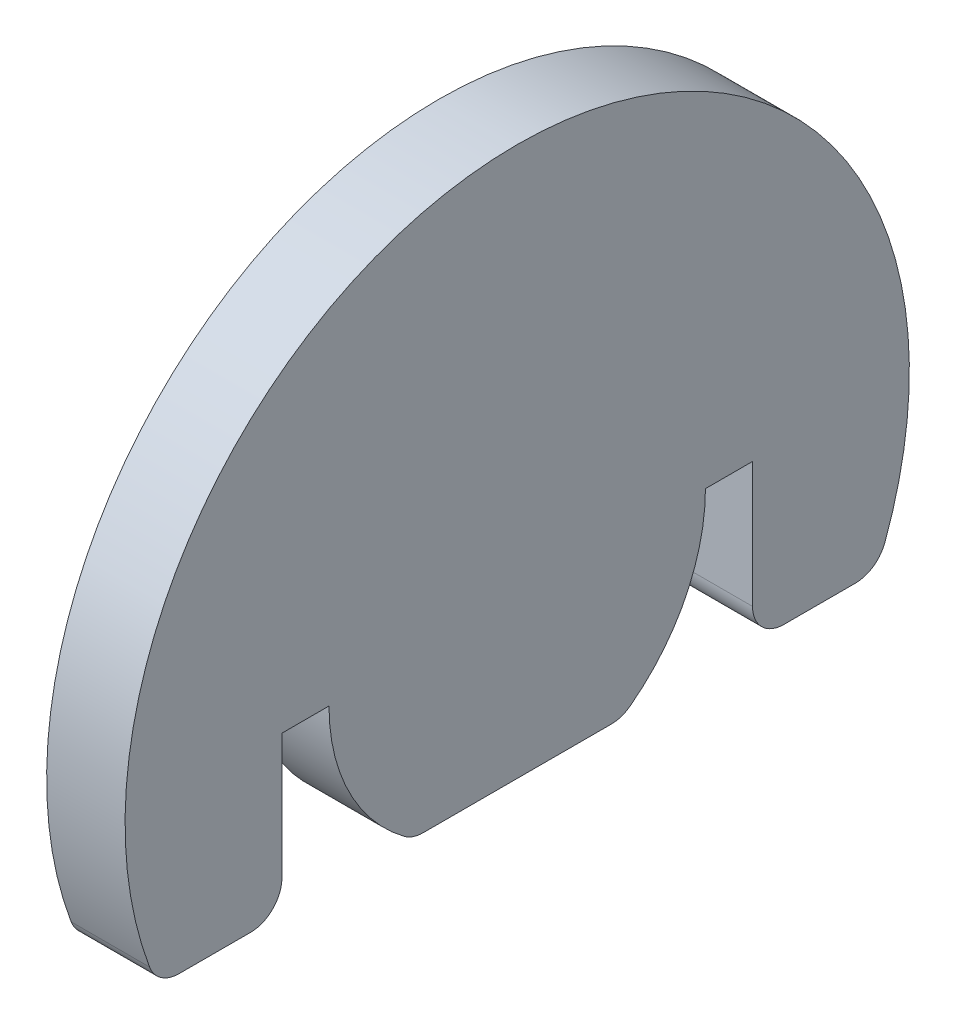
ISO-10303-21;
HEADER;
FILE_DESCRIPTION(('STEP AP214'),'2;1');
FILE_NAME('part.step','',(''),(''),'','','');
FILE_SCHEMA(('AUTOMOTIVE_DESIGN { 1 0 10303 214 1 1 1 1 }'));
ENDSEC;
DATA;
#1=APPLICATION_CONTEXT('core data for automotive mechanical design processes');
#2=APPLICATION_PROTOCOL_DEFINITION('international standard','automotive_design',2000,#1);
#3=PRODUCT_CONTEXT('',#1,'mechanical');
#4=PRODUCT('Part','Part','',(#3));
#5=PRODUCT_RELATED_PRODUCT_CATEGORY('part','',(#4));
#6=PRODUCT_DEFINITION_FORMATION('','',#4);
#7=PRODUCT_DEFINITION_CONTEXT('part definition',#1,'design');
#8=PRODUCT_DEFINITION('design','',#6,#7);
#9=PRODUCT_DEFINITION_SHAPE('','',#8);
#10=(LENGTH_UNIT() NAMED_UNIT(*) SI_UNIT(.MILLI.,.METRE.));
#11=(NAMED_UNIT(*) PLANE_ANGLE_UNIT() SI_UNIT($,.RADIAN.));
#12=(NAMED_UNIT(*) SI_UNIT($,.STERADIAN.) SOLID_ANGLE_UNIT());
#13=UNCERTAINTY_MEASURE_WITH_UNIT(LENGTH_MEASURE(1.E-05),#10,'distance_accuracy_value','');
#14=(GEOMETRIC_REPRESENTATION_CONTEXT(3) GLOBAL_UNCERTAINTY_ASSIGNED_CONTEXT((#13)) GLOBAL_UNIT_ASSIGNED_CONTEXT((#10,
#11,#12)) REPRESENTATION_CONTEXT('',''));
#15=CARTESIAN_POINT('',(0.,0.,0.));
#16=DIRECTION('',(0.,0.,1.));
#17=DIRECTION('',(1.,0.,0.));
#18=AXIS2_PLACEMENT_3D('',#15,#16,#17);
#19=CARTESIAN_POINT('',(1.25,0.,0.));
#20=DIRECTION('',(-1.,0.,0.));
#21=DIRECTION('',(0.,0.,1.));
#22=AXIS2_PLACEMENT_3D('',#19,#20,#21);
#23=CYLINDRICAL_SURFACE('',#22,6.);
#24=CARTESIAN_POINT('',(1.25,0.,0.));
#25=DIRECTION('',(1.,0.,0.));
#26=DIRECTION('',(0.,0.,-1.));
#27=AXIS2_PLACEMENT_3D('',#24,#25,#26);
#28=CIRCLE('',#27,6.);
#29=CARTESIAN_POINT('',(1.25,0.,-6.));
#30=VERTEX_POINT('',#29);
#31=CARTESIAN_POINT('',(1.25,-4.8,-3.6));
#32=VERTEX_POINT('',#31);
#33=EDGE_CURVE('E163',#30,#32,#28,.F.);
#34=ORIENTED_EDGE('',*,*,#33,.T.);
#35=DIRECTION('',(-1.,0.,0.));
#36=VECTOR('',#35,1.);
#37=CARTESIAN_POINT('',(1.25,-4.8,-3.6));
#38=LINE('',#37,#36);
#39=CARTESIAN_POINT('',(-1.25,-4.8,-3.6));
#40=VERTEX_POINT('',#39);
#41=EDGE_CURVE('E170',#32,#40,#38,.T.);
#42=ORIENTED_EDGE('',*,*,#41,.T.);
#43=CARTESIAN_POINT('',(-1.25,0.,0.));
#44=DIRECTION('',(1.,0.,0.));
#45=DIRECTION('',(0.,0.,-1.));
#46=AXIS2_PLACEMENT_3D('',#43,#44,#45);
#47=CIRCLE('',#46,6.);
#48=CARTESIAN_POINT('',(-1.25,0.,-6.));
#49=VERTEX_POINT('',#48);
#50=EDGE_CURVE('E166',#49,#40,#47,.F.);
#51=ORIENTED_EDGE('',*,*,#50,.F.);
#52=DIRECTION('',(-1.,0.,0.));
#53=VECTOR('',#52,1.);
#54=CARTESIAN_POINT('',(1.25,0.,-6.));
#55=LINE('',#54,#53);
#56=EDGE_CURVE('E159',#30,#49,#55,.T.);
#57=ORIENTED_EDGE('',*,*,#56,.F.);
#58=EDGE_LOOP('',(#34,#42,#51,#57));
#59=FACE_BOUND('',#58,.T.);
#60=ADVANCED_FACE('F43',(#59),#23,.T.);
#61=CARTESIAN_POINT('',(1.25,0.,0.));
#62=DIRECTION('',(0.,1.,0.));
#63=DIRECTION('',(0.,0.,1.));
#64=AXIS2_PLACEMENT_3D('',#61,#62,#63);
#65=PLANE('',#64);
#66=DIRECTION('',(0.,0.,-1.));
#67=VECTOR('',#66,1.);
#68=CARTESIAN_POINT('',(-1.25,0.,0.));
#69=LINE('',#68,#67);
#70=CARTESIAN_POINT('',(-1.25,0.,-7.5));
#71=VERTEX_POINT('',#70);
#72=EDGE_CURVE('E224',#49,#71,#69,.T.);
#73=ORIENTED_EDGE('',*,*,#72,.T.);
#74=DIRECTION('',(-1.,0.,0.));
#75=VECTOR('',#74,1.);
#76=CARTESIAN_POINT('',(1.25,0.,-7.5));
#77=LINE('',#76,#75);
#78=CARTESIAN_POINT('',(1.25,0.,-7.5));
#79=VERTEX_POINT('',#78);
#80=EDGE_CURVE('E171',#79,#71,#77,.T.);
#81=ORIENTED_EDGE('',*,*,#80,.F.);
#82=DIRECTION('',(0.,0.,-1.));
#83=VECTOR('',#82,1.);
#84=CARTESIAN_POINT('',(1.25,0.,0.));
#85=LINE('',#84,#83);
#86=EDGE_CURVE('E174',#30,#79,#85,.T.);
#87=ORIENTED_EDGE('',*,*,#86,.F.);
#88=ORIENTED_EDGE('',*,*,#56,.T.);
#89=EDGE_LOOP('',(#73,#81,#87,#88));
#90=FACE_BOUND('',#89,.T.);
#91=ADVANCED_FACE('F175',(#90),#65,.F.);
#92=CARTESIAN_POINT('',(1.25,0.,-7.5));
#93=DIRECTION('',(0.,0.,-1.));
#94=DIRECTION('',(0.,1.,0.));
#95=AXIS2_PLACEMENT_3D('',#92,#93,#94);
#96=PLANE('',#95);
#97=DIRECTION('',(0.,-1.,0.));
#98=VECTOR('',#97,1.);
#99=CARTESIAN_POINT('',(-1.25,0.,-7.5));
#100=LINE('',#99,#98);
#101=CARTESIAN_POINT('',(-1.25,-4.,-7.5));
#102=VERTEX_POINT('',#101);
#103=EDGE_CURVE('E227',#71,#102,#100,.T.);
#104=ORIENTED_EDGE('',*,*,#103,.T.);
#105=DIRECTION('',(-1.,0.,0.));
#106=VECTOR('',#105,1.);
#107=CARTESIAN_POINT('',(1.25,-4.,-7.5));
#108=LINE('',#107,#106);
#109=CARTESIAN_POINT('',(1.25,-4.,-7.5));
#110=VERTEX_POINT('',#109);
#111=EDGE_CURVE('E11',#102,#110,#108,.F.);
#112=ORIENTED_EDGE('',*,*,#111,.T.);
#113=DIRECTION('',(0.,-1.,0.));
#114=VECTOR('',#113,1.);
#115=CARTESIAN_POINT('',(1.25,0.,-7.5));
#116=LINE('',#115,#114);
#117=EDGE_CURVE('E180',#79,#110,#116,.T.);
#118=ORIENTED_EDGE('',*,*,#117,.F.);
#119=ORIENTED_EDGE('',*,*,#80,.T.);
#120=EDGE_LOOP('',(#104,#112,#118,#119));
#121=FACE_BOUND('',#120,.T.);
#122=ADVANCED_FACE('F388',(#121),#96,.F.);
#123=CARTESIAN_POINT('',(1.25,-5.,0.));
#124=DIRECTION('',(0.,1.,0.));
#125=DIRECTION('',(0.,0.,1.));
#126=AXIS2_PLACEMENT_3D('',#123,#124,#125);
#127=PLANE('',#126);
#128=DIRECTION('',(0.,0.,-1.));
#129=VECTOR('',#128,1.);
#130=CARTESIAN_POINT('',(-1.25,-5.,0.));
#131=LINE('',#130,#129);
#132=CARTESIAN_POINT('',(-1.25,-5.,-8.5));
#133=VERTEX_POINT('',#132);
#134=CARTESIAN_POINT('',(-1.25,-5.,-10.7819293264239));
#135=VERTEX_POINT('',#134);
#136=EDGE_CURVE('E231',#133,#135,#131,.T.);
#137=ORIENTED_EDGE('',*,*,#136,.T.);
#138=DIRECTION('',(-1.,0.,0.));
#139=VECTOR('',#138,1.);
#140=CARTESIAN_POINT('',(1.25,-5.,-10.7819293264239));
#141=LINE('',#140,#139);
#142=CARTESIAN_POINT('',(1.25,-5.,-10.7819293264239));
#143=VERTEX_POINT('',#142);
#144=EDGE_CURVE('E52',#135,#143,#141,.F.);
#145=ORIENTED_EDGE('',*,*,#144,.T.);
#146=DIRECTION('',(0.,0.,-1.));
#147=VECTOR('',#146,1.);
#148=CARTESIAN_POINT('',(1.25,-5.,0.));
#149=LINE('',#148,#147);
#150=CARTESIAN_POINT('',(1.25,-5.,-8.5));
#151=VERTEX_POINT('',#150);
#152=EDGE_CURVE('E196',#151,#143,#149,.T.);
#153=ORIENTED_EDGE('',*,*,#152,.F.);
#154=DIRECTION('',(-1.,0.,0.));
#155=VECTOR('',#154,1.);
#156=CARTESIAN_POINT('',(1.25,-5.,-8.5));
#157=LINE('',#156,#155);
#158=EDGE_CURVE('E324',#151,#133,#157,.T.);
#159=ORIENTED_EDGE('',*,*,#158,.T.);
#160=EDGE_LOOP('',(#137,#145,#153,#159));
#161=FACE_BOUND('',#160,.T.);
#162=ADVANCED_FACE('F331',(#161),#127,.F.);
#163=CARTESIAN_POINT('',(1.25,0.,0.));
#164=DIRECTION('',(-1.,0.,0.));
#165=DIRECTION('',(0.,0.,1.));
#166=AXIS2_PLACEMENT_3D('',#163,#164,#165);
#167=CYLINDRICAL_SURFACE('',#166,12.5);
#168=CARTESIAN_POINT('',(1.25,0.,0.));
#169=DIRECTION('',(1.,0.,0.));
#170=DIRECTION('',(0.,0.,-1.));
#171=AXIS2_PLACEMENT_3D('',#168,#169,#170);
#172=CIRCLE('',#171,12.5);
#173=CARTESIAN_POINT('',(1.25,-4.34782608695652,-11.7194883982869));
#174=VERTEX_POINT('',#173);
#175=CARTESIAN_POINT('',(1.25,-4.34782608695652,11.7194883982869));
#176=VERTEX_POINT('',#175);
#177=EDGE_CURVE('E200',#174,#176,#172,.T.);
#178=ORIENTED_EDGE('',*,*,#177,.F.);
#179=DIRECTION('',(-1.,0.,0.));
#180=VECTOR('',#179,1.);
#181=CARTESIAN_POINT('',(1.25,-4.34782608695652,-11.7194883982869));
#182=LINE('',#181,#180);
#183=CARTESIAN_POINT('',(-1.25,-4.34782608695652,-11.7194883982869));
#184=VERTEX_POINT('',#183);
#185=EDGE_CURVE('E320',#174,#184,#182,.T.);
#186=ORIENTED_EDGE('',*,*,#185,.T.);
#187=CARTESIAN_POINT('',(-1.25,0.,0.));
#188=DIRECTION('',(1.,0.,0.));
#189=DIRECTION('',(0.,0.,-1.));
#190=AXIS2_PLACEMENT_3D('',#187,#188,#189);
#191=CIRCLE('',#190,12.5);
#192=CARTESIAN_POINT('',(-1.25,-4.34782608695652,11.7194883982869));
#193=VERTEX_POINT('',#192);
#194=EDGE_CURVE('E235',#184,#193,#191,.T.);
#195=ORIENTED_EDGE('',*,*,#194,.T.);
#196=DIRECTION('',(-1.,0.,0.));
#197=VECTOR('',#196,1.);
#198=CARTESIAN_POINT('',(1.25,-4.34782608695652,11.7194883982869));
#199=LINE('',#198,#197);
#200=EDGE_CURVE('E317',#193,#176,#199,.F.);
#201=ORIENTED_EDGE('',*,*,#200,.T.);
#202=EDGE_LOOP('',(#178,#186,#195,#201));
#203=FACE_BOUND('',#202,.T.);
#204=ADVANCED_FACE('F342',(#203),#167,.T.);
#205=CARTESIAN_POINT('',(1.25,-5.,0.));
#206=DIRECTION('',(0.,-1.,0.));
#207=DIRECTION('',(0.,0.,-1.));
#208=AXIS2_PLACEMENT_3D('',#205,#206,#207);
#209=PLANE('',#208);
#210=DIRECTION('',(0.,0.,1.));
#211=VECTOR('',#210,1.);
#212=CARTESIAN_POINT('',(-1.25,-5.,0.));
#213=LINE('',#212,#211);
#214=CARTESIAN_POINT('',(-1.25,-5.,8.5));
#215=VERTEX_POINT('',#214);
#216=CARTESIAN_POINT('',(-1.25,-5.,10.7819293264239));
#217=VERTEX_POINT('',#216);
#218=EDGE_CURVE('E239',#215,#217,#213,.T.);
#219=ORIENTED_EDGE('',*,*,#218,.F.);
#220=DIRECTION('',(-1.,0.,0.));
#221=VECTOR('',#220,1.);
#222=CARTESIAN_POINT('',(1.25,-5.,8.5));
#223=LINE('',#222,#221);
#224=CARTESIAN_POINT('',(1.25,-5.,8.5));
#225=VERTEX_POINT('',#224);
#226=EDGE_CURVE('E314',#215,#225,#223,.F.);
#227=ORIENTED_EDGE('',*,*,#226,.T.);
#228=DIRECTION('',(0.,0.,1.));
#229=VECTOR('',#228,1.);
#230=CARTESIAN_POINT('',(1.25,-5.,0.));
#231=LINE('',#230,#229);
#232=CARTESIAN_POINT('',(1.25,-5.,10.7819293264239));
#233=VERTEX_POINT('',#232);
#234=EDGE_CURVE('E204',#225,#233,#231,.T.);
#235=ORIENTED_EDGE('',*,*,#234,.T.);
#236=DIRECTION('',(1.,0.,0.));
#237=VECTOR('',#236,1.);
#238=CARTESIAN_POINT('',(-1.25,-5.,10.7819293264239));
#239=LINE('',#238,#237);
#240=EDGE_CURVE('E310',#233,#217,#239,.F.);
#241=ORIENTED_EDGE('',*,*,#240,.T.);
#242=EDGE_LOOP('',(#219,#227,#235,#241));
#243=FACE_BOUND('',#242,.T.);
#244=ADVANCED_FACE('F351',(#243),#209,.T.);
#245=CARTESIAN_POINT('',(1.25,0.,7.5));
#246=DIRECTION('',(0.,0.,-1.));
#247=DIRECTION('',(0.,1.,0.));
#248=AXIS2_PLACEMENT_3D('',#245,#246,#247);
#249=PLANE('',#248);
#250=DIRECTION('',(0.,-1.,0.));
#251=VECTOR('',#250,1.);
#252=CARTESIAN_POINT('',(1.25,0.,7.5));
#253=LINE('',#252,#251);
#254=CARTESIAN_POINT('',(1.25,0.,7.5));
#255=VERTEX_POINT('',#254);
#256=CARTESIAN_POINT('',(1.25,-4.,7.5));
#257=VERTEX_POINT('',#256);
#258=EDGE_CURVE('E208',#255,#257,#253,.T.);
#259=ORIENTED_EDGE('',*,*,#258,.T.);
#260=DIRECTION('',(-1.,0.,0.));
#261=VECTOR('',#260,1.);
#262=CARTESIAN_POINT('',(1.25,-4.,7.5));
#263=LINE('',#262,#261);
#264=CARTESIAN_POINT('',(-1.25,-4.,7.5));
#265=VERTEX_POINT('',#264);
#266=EDGE_CURVE('E306',#257,#265,#263,.T.);
#267=ORIENTED_EDGE('',*,*,#266,.T.);
#268=DIRECTION('',(0.,-1.,0.));
#269=VECTOR('',#268,1.);
#270=CARTESIAN_POINT('',(-1.25,0.,7.5));
#271=LINE('',#270,#269);
#272=CARTESIAN_POINT('',(-1.25,0.,7.5));
#273=VERTEX_POINT('',#272);
#274=EDGE_CURVE('E243',#273,#265,#271,.T.);
#275=ORIENTED_EDGE('',*,*,#274,.F.);
#276=DIRECTION('',(-1.,0.,0.));
#277=VECTOR('',#276,1.);
#278=CARTESIAN_POINT('',(1.25,0.,7.5));
#279=LINE('',#278,#277);
#280=EDGE_CURVE('E256',#255,#273,#279,.T.);
#281=ORIENTED_EDGE('',*,*,#280,.F.);
#282=EDGE_LOOP('',(#259,#267,#275,#281));
#283=FACE_BOUND('',#282,.T.);
#284=ADVANCED_FACE('F358',(#283),#249,.T.);
#285=CARTESIAN_POINT('',(1.25,0.,0.));
#286=DIRECTION('',(0.,-1.,0.));
#287=DIRECTION('',(0.,0.,-1.));
#288=AXIS2_PLACEMENT_3D('',#285,#286,#287);
#289=PLANE('',#288);
#290=DIRECTION('',(0.,0.,1.));
#291=VECTOR('',#290,1.);
#292=CARTESIAN_POINT('',(-1.25,0.,0.));
#293=LINE('',#292,#291);
#294=CARTESIAN_POINT('',(-1.25,0.,6.));
#295=VERTEX_POINT('',#294);
#296=EDGE_CURVE('E247',#295,#273,#293,.T.);
#297=ORIENTED_EDGE('',*,*,#296,.F.);
#298=DIRECTION('',(-1.,0.,0.));
#299=VECTOR('',#298,1.);
#300=CARTESIAN_POINT('',(1.25,0.,6.));
#301=LINE('',#300,#299);
#302=CARTESIAN_POINT('',(1.25,0.,6.));
#303=VERTEX_POINT('',#302);
#304=EDGE_CURVE('E221',#303,#295,#301,.T.);
#305=ORIENTED_EDGE('',*,*,#304,.F.);
#306=DIRECTION('',(0.,0.,1.));
#307=VECTOR('',#306,1.);
#308=CARTESIAN_POINT('',(1.25,0.,0.));
#309=LINE('',#308,#307);
#310=EDGE_CURVE('E211',#303,#255,#309,.T.);
#311=ORIENTED_EDGE('',*,*,#310,.T.);
#312=ORIENTED_EDGE('',*,*,#280,.T.);
#313=EDGE_LOOP('',(#297,#305,#311,#312));
#314=FACE_BOUND('',#313,.T.);
#315=ADVANCED_FACE('F362',(#314),#289,.T.);
#316=CARTESIAN_POINT('',(1.25,0.,0.));
#317=DIRECTION('',(-1.,0.,0.));
#318=DIRECTION('',(0.,0.,1.));
#319=AXIS2_PLACEMENT_3D('',#316,#317,#318);
#320=CYLINDRICAL_SURFACE('',#319,6.);
#321=CARTESIAN_POINT('',(-1.25,0.,0.));
#322=DIRECTION('',(1.,0.,0.));
#323=DIRECTION('',(0.,0.,-1.));
#324=AXIS2_PLACEMENT_3D('',#321,#322,#323);
#325=CIRCLE('',#324,6.);
#326=CARTESIAN_POINT('',(-1.25,-4.8,3.6));
#327=VERTEX_POINT('',#326);
#328=EDGE_CURVE('E191',#327,#295,#325,.F.);
#329=ORIENTED_EDGE('',*,*,#328,.F.);
#330=DIRECTION('',(-1.,0.,0.));
#331=VECTOR('',#330,1.);
#332=CARTESIAN_POINT('',(1.25,-4.8,3.6));
#333=LINE('',#332,#331);
#334=CARTESIAN_POINT('',(1.25,-4.8,3.6));
#335=VERTEX_POINT('',#334);
#336=EDGE_CURVE('E59',#327,#335,#333,.F.);
#337=ORIENTED_EDGE('',*,*,#336,.T.);
#338=CARTESIAN_POINT('',(1.25,0.,0.));
#339=DIRECTION('',(1.,0.,0.));
#340=DIRECTION('',(0.,0.,-1.));
#341=AXIS2_PLACEMENT_3D('',#338,#339,#340);
#342=CIRCLE('',#341,6.);
#343=EDGE_CURVE('E215',#335,#303,#342,.F.);
#344=ORIENTED_EDGE('',*,*,#343,.T.);
#345=ORIENTED_EDGE('',*,*,#304,.T.);
#346=EDGE_LOOP('',(#329,#337,#344,#345));
#347=FACE_BOUND('',#346,.T.);
#348=ADVANCED_FACE('F404',(#347),#320,.T.);
#349=CARTESIAN_POINT('',(1.25,-5.,0.));
#350=DIRECTION('',(0.,1.,0.));
#351=DIRECTION('',(0.,0.,1.));
#352=AXIS2_PLACEMENT_3D('',#349,#350,#351);
#353=PLANE('',#352);
#354=DIRECTION('',(0.,0.,-1.));
#355=VECTOR('',#354,1.);
#356=CARTESIAN_POINT('',(-1.25,-5.,0.));
#357=LINE('',#356,#355);
#358=CARTESIAN_POINT('',(-1.25,-5.,3.));
#359=VERTEX_POINT('',#358);
#360=CARTESIAN_POINT('',(-1.25,-5.,-3.));
#361=VERTEX_POINT('',#360);
#362=EDGE_CURVE('E187',#359,#361,#357,.T.);
#363=ORIENTED_EDGE('',*,*,#362,.T.);
#364=DIRECTION('',(1.,0.,0.));
#365=VECTOR('',#364,1.);
#366=CARTESIAN_POINT('',(1.25,-5.,-3.));
#367=LINE('',#366,#365);
#368=CARTESIAN_POINT('',(1.25,-5.,-3.));
#369=VERTEX_POINT('',#368);
#370=EDGE_CURVE('E285',#361,#369,#367,.T.);
#371=ORIENTED_EDGE('',*,*,#370,.T.);
#372=DIRECTION('',(0.,0.,-1.));
#373=VECTOR('',#372,1.);
#374=CARTESIAN_POINT('',(1.25,-5.,0.));
#375=LINE('',#374,#373);
#376=CARTESIAN_POINT('',(1.25,-5.,3.));
#377=VERTEX_POINT('',#376);
#378=EDGE_CURVE('E218',#377,#369,#375,.T.);
#379=ORIENTED_EDGE('',*,*,#378,.F.);
#380=DIRECTION('',(1.,0.,0.));
#381=VECTOR('',#380,1.);
#382=CARTESIAN_POINT('',(-1.25,-5.,3.));
#383=LINE('',#382,#381);
#384=EDGE_CURVE('E281',#377,#359,#383,.F.);
#385=ORIENTED_EDGE('',*,*,#384,.T.);
#386=EDGE_LOOP('',(#363,#371,#379,#385));
#387=FACE_BOUND('',#386,.T.);
#388=ADVANCED_FACE('F371',(#387),#353,.F.);
#389=CARTESIAN_POINT('',(1.25,0.,0.));
#390=DIRECTION('',(1.,0.,0.));
#391=DIRECTION('',(0.,0.,-1.));
#392=AXIS2_PLACEMENT_3D('',#389,#390,#391);
#393=PLANE('',#392);
#394=ORIENTED_EDGE('',*,*,#378,.T.);
#395=CARTESIAN_POINT('',(1.25,-4.,-3.));
#396=DIRECTION('',(1.,0.,0.));
#397=DIRECTION('',(0.,0.,-1.));
#398=AXIS2_PLACEMENT_3D('',#395,#396,#397);
#399=CIRCLE('',#398,1.);
#400=EDGE_CURVE('E185',#369,#32,#399,.T.);
#401=ORIENTED_EDGE('',*,*,#400,.T.);
#402=ORIENTED_EDGE('',*,*,#33,.F.);
#403=ORIENTED_EDGE('',*,*,#86,.T.);
#404=ORIENTED_EDGE('',*,*,#117,.T.);
#405=CARTESIAN_POINT('',(1.25,-4.,-8.5));
#406=DIRECTION('',(1.,0.,0.));
#407=DIRECTION('',(0.,0.,-1.));
#408=AXIS2_PLACEMENT_3D('',#405,#406,#407);
#409=CIRCLE('',#408,1.);
#410=EDGE_CURVE('E291',#110,#151,#409,.T.);
#411=ORIENTED_EDGE('',*,*,#410,.T.);
#412=ORIENTED_EDGE('',*,*,#152,.T.);
#413=CARTESIAN_POINT('',(1.25,-4.,-10.7819293264239));
#414=DIRECTION('',(1.,0.,0.));
#415=DIRECTION('',(0.,0.,-1.));
#416=AXIS2_PLACEMENT_3D('',#413,#414,#415);
#417=CIRCLE('',#416,1.);
#418=EDGE_CURVE('E294',#143,#174,#417,.T.);
#419=ORIENTED_EDGE('',*,*,#418,.T.);
#420=ORIENTED_EDGE('',*,*,#177,.T.);
#421=CARTESIAN_POINT('',(1.25,-4.,10.7819293264239));
#422=DIRECTION('',(1.,0.,0.));
#423=DIRECTION('',(0.,0.,-1.));
#424=AXIS2_PLACEMENT_3D('',#421,#422,#423);
#425=CIRCLE('',#424,1.);
#426=EDGE_CURVE('E288',#176,#233,#425,.T.);
#427=ORIENTED_EDGE('',*,*,#426,.T.);
#428=ORIENTED_EDGE('',*,*,#234,.F.);
#429=CARTESIAN_POINT('',(1.25,-4.,8.5));
#430=DIRECTION('',(1.,0.,0.));
#431=DIRECTION('',(0.,0.,-1.));
#432=AXIS2_PLACEMENT_3D('',#429,#430,#431);
#433=CIRCLE('',#432,1.);
#434=EDGE_CURVE('E67',#225,#257,#433,.T.);
#435=ORIENTED_EDGE('',*,*,#434,.T.);
#436=ORIENTED_EDGE('',*,*,#258,.F.);
#437=ORIENTED_EDGE('',*,*,#310,.F.);
#438=ORIENTED_EDGE('',*,*,#343,.F.);
#439=CARTESIAN_POINT('',(1.25,-4.,3.));
#440=DIRECTION('',(1.,0.,0.));
#441=DIRECTION('',(0.,0.,-1.));
#442=AXIS2_PLACEMENT_3D('',#439,#440,#441);
#443=CIRCLE('',#442,1.);
#444=EDGE_CURVE('E299',#335,#377,#443,.T.);
#445=ORIENTED_EDGE('',*,*,#444,.T.);
#446=EDGE_LOOP('',(#394,#401,#402,#403,#404,#411,#412,#419,#420,#427,#428,#435,#436,#437,#438,#445));
#447=FACE_BOUND('',#446,.T.);
#448=ADVANCED_FACE('F183',(#447),#393,.T.);
#449=CARTESIAN_POINT('',(-1.25,0.,0.));
#450=DIRECTION('',(1.,0.,0.));
#451=DIRECTION('',(0.,0.,-1.));
#452=AXIS2_PLACEMENT_3D('',#449,#450,#451);
#453=PLANE('',#452);
#454=ORIENTED_EDGE('',*,*,#50,.T.);
#455=CARTESIAN_POINT('',(-1.25,-4.,-3.));
#456=DIRECTION('',(1.,0.,0.));
#457=DIRECTION('',(0.,0.,-1.));
#458=AXIS2_PLACEMENT_3D('',#455,#456,#457);
#459=CIRCLE('',#458,1.);
#460=EDGE_CURVE('E278',#40,#361,#459,.F.);
#461=ORIENTED_EDGE('',*,*,#460,.T.);
#462=ORIENTED_EDGE('',*,*,#362,.F.);
#463=CARTESIAN_POINT('',(-1.25,-4.,3.));
#464=DIRECTION('',(1.,0.,0.));
#465=DIRECTION('',(0.,0.,-1.));
#466=AXIS2_PLACEMENT_3D('',#463,#464,#465);
#467=CIRCLE('',#466,1.);
#468=EDGE_CURVE('E275',#359,#327,#467,.F.);
#469=ORIENTED_EDGE('',*,*,#468,.T.);
#470=ORIENTED_EDGE('',*,*,#328,.T.);
#471=ORIENTED_EDGE('',*,*,#296,.T.);
#472=ORIENTED_EDGE('',*,*,#274,.T.);
#473=CARTESIAN_POINT('',(-1.25,-4.,8.5));
#474=DIRECTION('',(1.,0.,0.));
#475=DIRECTION('',(0.,0.,-1.));
#476=AXIS2_PLACEMENT_3D('',#473,#474,#475);
#477=CIRCLE('',#476,1.);
#478=EDGE_CURVE('E272',#265,#215,#477,.F.);
#479=ORIENTED_EDGE('',*,*,#478,.T.);
#480=ORIENTED_EDGE('',*,*,#218,.T.);
#481=CARTESIAN_POINT('',(-1.25,-4.,10.7819293264239));
#482=DIRECTION('',(1.,0.,0.));
#483=DIRECTION('',(0.,0.,-1.));
#484=AXIS2_PLACEMENT_3D('',#481,#482,#483);
#485=CIRCLE('',#484,1.);
#486=EDGE_CURVE('E263',#217,#193,#485,.F.);
#487=ORIENTED_EDGE('',*,*,#486,.T.);
#488=ORIENTED_EDGE('',*,*,#194,.F.);
#489=CARTESIAN_POINT('',(-1.25,-4.,-10.7819293264239));
#490=DIRECTION('',(1.,0.,0.));
#491=DIRECTION('',(0.,0.,-1.));
#492=AXIS2_PLACEMENT_3D('',#489,#490,#491);
#493=CIRCLE('',#492,1.);
#494=EDGE_CURVE('E269',#184,#135,#493,.F.);
#495=ORIENTED_EDGE('',*,*,#494,.T.);
#496=ORIENTED_EDGE('',*,*,#136,.F.);
#497=CARTESIAN_POINT('',(-1.25,-4.,-8.5));
#498=DIRECTION('',(1.,0.,0.));
#499=DIRECTION('',(0.,0.,-1.));
#500=AXIS2_PLACEMENT_3D('',#497,#498,#499);
#501=CIRCLE('',#500,1.);
#502=EDGE_CURVE('E266',#133,#102,#501,.F.);
#503=ORIENTED_EDGE('',*,*,#502,.T.);
#504=ORIENTED_EDGE('',*,*,#103,.F.);
#505=ORIENTED_EDGE('',*,*,#72,.F.);
#506=EDGE_LOOP('',(#454,#461,#462,#469,#470,#471,#472,#479,#480,#487,#488,#495,#496,#503,#504,#505));
#507=FACE_BOUND('',#506,.T.);
#508=ADVANCED_FACE('F345',(#507),#453,.F.);
#509=CARTESIAN_POINT('',(1.25,-4.,-3.));
#510=DIRECTION('',(-1.,0.,0.));
#511=DIRECTION('',(0.,0.,1.));
#512=AXIS2_PLACEMENT_3D('',#509,#510,#511);
#513=CYLINDRICAL_SURFACE('',#512,1.);
#514=ORIENTED_EDGE('',*,*,#400,.F.);
#515=ORIENTED_EDGE('',*,*,#370,.F.);
#516=ORIENTED_EDGE('',*,*,#460,.F.);
#517=ORIENTED_EDGE('',*,*,#41,.F.);
#518=EDGE_LOOP('',(#514,#515,#516,#517));
#519=FACE_BOUND('',#518,.T.);
#520=ADVANCED_FACE('F374',(#519),#513,.T.);
#521=CARTESIAN_POINT('',(1.25,-4.,3.));
#522=DIRECTION('',(-1.,0.,0.));
#523=DIRECTION('',(0.,0.,1.));
#524=AXIS2_PLACEMENT_3D('',#521,#522,#523);
#525=CYLINDRICAL_SURFACE('',#524,1.);
#526=ORIENTED_EDGE('',*,*,#444,.F.);
#527=ORIENTED_EDGE('',*,*,#336,.F.);
#528=ORIENTED_EDGE('',*,*,#468,.F.);
#529=ORIENTED_EDGE('',*,*,#384,.F.);
#530=EDGE_LOOP('',(#526,#527,#528,#529));
#531=FACE_BOUND('',#530,.T.);
#532=ADVANCED_FACE('F368',(#531),#525,.T.);
#533=CARTESIAN_POINT('',(1.25,-4.,8.5));
#534=DIRECTION('',(-1.,0.,0.));
#535=DIRECTION('',(0.,0.,1.));
#536=AXIS2_PLACEMENT_3D('',#533,#534,#535);
#537=CYLINDRICAL_SURFACE('',#536,1.);
#538=ORIENTED_EDGE('',*,*,#434,.F.);
#539=ORIENTED_EDGE('',*,*,#226,.F.);
#540=ORIENTED_EDGE('',*,*,#478,.F.);
#541=ORIENTED_EDGE('',*,*,#266,.F.);
#542=EDGE_LOOP('',(#538,#539,#540,#541));
#543=FACE_BOUND('',#542,.T.);
#544=ADVANCED_FACE('F355',(#543),#537,.T.);
#545=CARTESIAN_POINT('',(1.25,-4.,-10.7819293264239));
#546=DIRECTION('',(-1.,0.,0.));
#547=DIRECTION('',(0.,0.,1.));
#548=AXIS2_PLACEMENT_3D('',#545,#546,#547);
#549=CYLINDRICAL_SURFACE('',#548,1.);
#550=ORIENTED_EDGE('',*,*,#418,.F.);
#551=ORIENTED_EDGE('',*,*,#144,.F.);
#552=ORIENTED_EDGE('',*,*,#494,.F.);
#553=ORIENTED_EDGE('',*,*,#185,.F.);
#554=EDGE_LOOP('',(#550,#551,#552,#553));
#555=FACE_BOUND('',#554,.T.);
#556=ADVANCED_FACE('F339',(#555),#549,.T.);
#557=CARTESIAN_POINT('',(1.25,-4.,-8.5));
#558=DIRECTION('',(-1.,0.,0.));
#559=DIRECTION('',(0.,0.,1.));
#560=AXIS2_PLACEMENT_3D('',#557,#558,#559);
#561=CYLINDRICAL_SURFACE('',#560,1.);
#562=ORIENTED_EDGE('',*,*,#410,.F.);
#563=ORIENTED_EDGE('',*,*,#111,.F.);
#564=ORIENTED_EDGE('',*,*,#502,.F.);
#565=ORIENTED_EDGE('',*,*,#158,.F.);
#566=EDGE_LOOP('',(#562,#563,#564,#565));
#567=FACE_BOUND('',#566,.T.);
#568=ADVANCED_FACE('F446',(#567),#561,.T.);
#569=CARTESIAN_POINT('',(1.25,-4.,10.7819293264239));
#570=DIRECTION('',(-1.,0.,0.));
#571=DIRECTION('',(0.,0.,1.));
#572=AXIS2_PLACEMENT_3D('',#569,#570,#571);
#573=CYLINDRICAL_SURFACE('',#572,1.);
#574=ORIENTED_EDGE('',*,*,#426,.F.);
#575=ORIENTED_EDGE('',*,*,#200,.F.);
#576=ORIENTED_EDGE('',*,*,#486,.F.);
#577=ORIENTED_EDGE('',*,*,#240,.F.);
#578=EDGE_LOOP('',(#574,#575,#576,#577));
#579=FACE_BOUND('',#578,.T.);
#580=ADVANCED_FACE('F45',(#579),#573,.T.);
#581=CLOSED_SHELL('',(#60,#91,#122,#162,#204,#244,#284,#315,#348,#388,#448,#508,#520,#532,#544,
#556,#568,#580));
#582=MANIFOLD_SOLID_BREP('B2',#581);
#583=ADVANCED_BREP_SHAPE_REPRESENTATION('',(#18,#582),#14);
#584=SHAPE_DEFINITION_REPRESENTATION(#9,#583);
ENDSEC;
END-ISO-10303-21;
